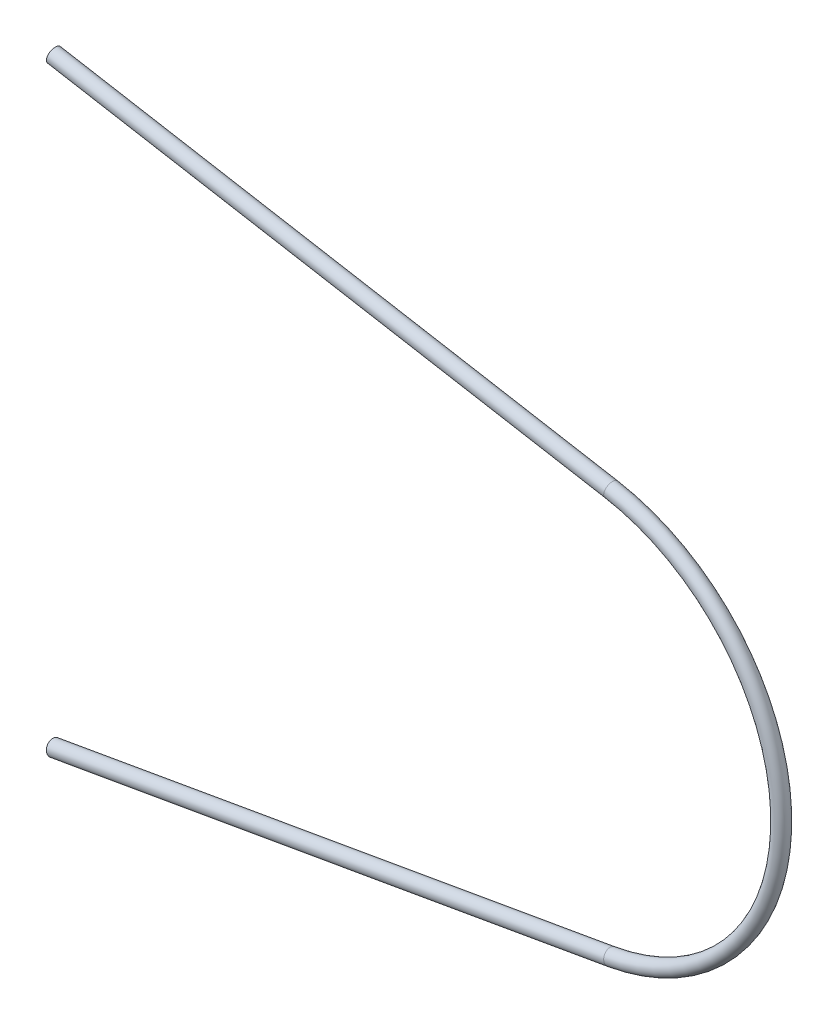
ISO-10303-21;
HEADER;
FILE_DESCRIPTION(('STEP AP214'),'2;1');
FILE_NAME('part.step','',(''),(''),'','','');
FILE_SCHEMA(('AUTOMOTIVE_DESIGN { 1 0 10303 214 1 1 1 1 }'));
ENDSEC;
DATA;
#1=APPLICATION_CONTEXT('core data for automotive mechanical design processes');
#2=APPLICATION_PROTOCOL_DEFINITION('international standard','automotive_design',2000,#1);
#3=PRODUCT_CONTEXT('',#1,'mechanical');
#4=PRODUCT('Part','Part','',(#3));
#5=PRODUCT_RELATED_PRODUCT_CATEGORY('part','',(#4));
#6=PRODUCT_DEFINITION_FORMATION('','',#4);
#7=PRODUCT_DEFINITION_CONTEXT('part definition',#1,'design');
#8=PRODUCT_DEFINITION('design','',#6,#7);
#9=PRODUCT_DEFINITION_SHAPE('','',#8);
#10=(LENGTH_UNIT() NAMED_UNIT(*) SI_UNIT(.MILLI.,.METRE.));
#11=(NAMED_UNIT(*) PLANE_ANGLE_UNIT() SI_UNIT($,.RADIAN.));
#12=(NAMED_UNIT(*) SI_UNIT($,.STERADIAN.) SOLID_ANGLE_UNIT());
#13=UNCERTAINTY_MEASURE_WITH_UNIT(LENGTH_MEASURE(1.E-05),#10,'distance_accuracy_value','');
#14=(GEOMETRIC_REPRESENTATION_CONTEXT(3) GLOBAL_UNCERTAINTY_ASSIGNED_CONTEXT((#13)) GLOBAL_UNIT_ASSIGNED_CONTEXT((#10,
#11,#12)) REPRESENTATION_CONTEXT('',''));
#15=CARTESIAN_POINT('',(0.,0.,0.));
#16=DIRECTION('',(0.,0.,1.));
#17=DIRECTION('',(1.,0.,0.));
#18=AXIS2_PLACEMENT_3D('',#15,#16,#17);
#19=CARTESIAN_POINT('',(-105.396551724138,-60.57901356626,0.));
#20=DIRECTION('',(0.985024610833497,0.172413793103448,0.));
#21=DIRECTION('',(0.,0.,1.));
#22=AXIS2_PLACEMENT_3D('',#19,#20,#21);
#23=PLANE('',#22);
#24=CARTESIAN_POINT('',(-105.396551724138,-60.57901356626,0.));
#25=DIRECTION('',(0.985024610833497,0.172413793103448,0.));
#26=DIRECTION('',(0.,0.,1.));
#27=AXIS2_PLACEMENT_3D('',#24,#25,#26);
#28=CIRCLE('',#27,1.5);
#29=CARTESIAN_POINT('',(-105.396551724138,-60.57901356626,1.5));
#30=VERTEX_POINT('',#29);
#31=EDGE_CURVE('E60',#30,#30,#28,.T.);
#32=ORIENTED_EDGE('',*,*,#31,.F.);
#33=EDGE_LOOP('',(#32));
#34=FACE_BOUND('',#33,.T.);
#35=ADVANCED_FACE('F48',(#34),#23,.F.);
#36=CARTESIAN_POINT('',(-105.396551724138,60.57901356626,0.));
#37=DIRECTION('',(-0.985024610833497,0.172413793103448,0.));
#38=DIRECTION('',(0.,0.,1.));
#39=AXIS2_PLACEMENT_3D('',#36,#37,#38);
#40=PLANE('',#39);
#41=CARTESIAN_POINT('',(-105.396551724138,60.57901356626,0.));
#42=DIRECTION('',(-0.985024610833497,0.172413793103448,0.));
#43=DIRECTION('',(0.,0.,1.));
#44=AXIS2_PLACEMENT_3D('',#41,#42,#43);
#45=CIRCLE('',#44,1.5);
#46=CARTESIAN_POINT('',(-105.396551724138,60.57901356626,1.5));
#47=VERTEX_POINT('',#46);
#48=EDGE_CURVE('E13',#47,#47,#45,.T.);
#49=ORIENTED_EDGE('',*,*,#48,.T.);
#50=EDGE_LOOP('',(#49));
#51=FACE_BOUND('',#50,.T.);
#52=ADVANCED_FACE('F63',(#51),#40,.T.);
#53=CARTESIAN_POINT('',(-105.396551724138,-60.57901356626,0.));
#54=DIRECTION('',(0.985024610833497,0.172413793103448,0.));
#55=DIRECTION('',(-0.172413793103448,0.985024610833497,0.));
#56=AXIS2_PLACEMENT_3D('',#53,#54,#55);
#57=CYLINDRICAL_SURFACE('',#56,1.5);
#58=CARTESIAN_POINT('',(7.1551724137931,-40.8785213495901,0.));
#59=DIRECTION('',(0.985024610833497,0.172413793103448,0.));
#60=DIRECTION('',(0.,0.,1.));
#61=AXIS2_PLACEMENT_3D('',#58,#59,#60);
#62=CIRCLE('',#61,1.5);
#63=CARTESIAN_POINT('',(7.41379310344828,-42.3560582658404,0.));
#64=VERTEX_POINT('',#63);
#65=EDGE_CURVE('E73',#64,#64,#62,.T.);
#66=ORIENTED_EDGE('',*,*,#65,.F.);
#67=EDGE_LOOP('',(#66));
#68=FACE_BOUND('',#67,.T.);
#69=ORIENTED_EDGE('',*,*,#31,.T.);
#70=EDGE_LOOP('',(#69));
#71=FACE_BOUND('',#70,.T.);
#72=ADVANCED_FACE('F78',(#68,#71),#57,.T.);
#73=CARTESIAN_POINT('',(0.,0.,0.));
#74=DIRECTION('',(0.,0.,1.));
#75=DIRECTION('',(1.,0.,0.));
#76=AXIS2_PLACEMENT_3D('',#73,#74,#75);
#77=TOROIDAL_SURFACE('',#76,41.5,1.5);
#78=CARTESIAN_POINT('',(7.15517241379311,40.8785213495901,0.));
#79=DIRECTION('',(-0.985024610833497,0.172413793103449,0.));
#80=DIRECTION('',(0.,0.,1.));
#81=AXIS2_PLACEMENT_3D('',#78,#79,#80);
#82=CIRCLE('',#81,1.5);
#83=CARTESIAN_POINT('',(7.41379310344829,42.3560582658404,0.));
#84=VERTEX_POINT('',#83);
#85=EDGE_CURVE('E55',#84,#84,#82,.T.);
#86=CARTESIAN_POINT('',(0.,0.,0.));
#87=DIRECTION('',(0.,0.,1.));
#88=DIRECTION('',(1.,0.,0.));
#89=AXIS2_PLACEMENT_3D('',#86,#87,#88);
#90=CIRCLE('',#89,43.);
#91=EDGE_CURVE('',#64,#84,#90,.T.);
#92=ORIENTED_EDGE('',*,*,#65,.T.);
#93=ORIENTED_EDGE('',*,*,#85,.F.);
#94=ORIENTED_EDGE('',*,*,#91,.T.);
#95=ORIENTED_EDGE('',*,*,#91,.F.);
#96=EDGE_LOOP('',(#92,#94,#93,#95));
#97=FACE_BOUND('',#96,.T.);
#98=ADVANCED_FACE('F68',(#97),#77,.T.);
#99=CARTESIAN_POINT('',(7.1551724137931,40.8785213495901,0.));
#100=DIRECTION('',(-0.985024610833497,0.172413793103448,0.));
#101=DIRECTION('',(-0.172413793103448,-0.985024610833497,0.));
#102=AXIS2_PLACEMENT_3D('',#99,#100,#101);
#103=CYLINDRICAL_SURFACE('',#102,1.5);
#104=ORIENTED_EDGE('',*,*,#48,.F.);
#105=EDGE_LOOP('',(#104));
#106=FACE_BOUND('',#105,.T.);
#107=ORIENTED_EDGE('',*,*,#85,.T.);
#108=EDGE_LOOP('',(#107));
#109=FACE_BOUND('',#108,.T.);
#110=ADVANCED_FACE('F65',(#106,#109),#103,.T.);
#111=CLOSED_SHELL('',(#35,#52,#72,#98,#110));
#112=MANIFOLD_SOLID_BREP('B2',#111);
#113=ADVANCED_BREP_SHAPE_REPRESENTATION('',(#18,#112),#14);
#114=SHAPE_DEFINITION_REPRESENTATION(#9,#113);
ENDSEC;
END-ISO-10303-21;
